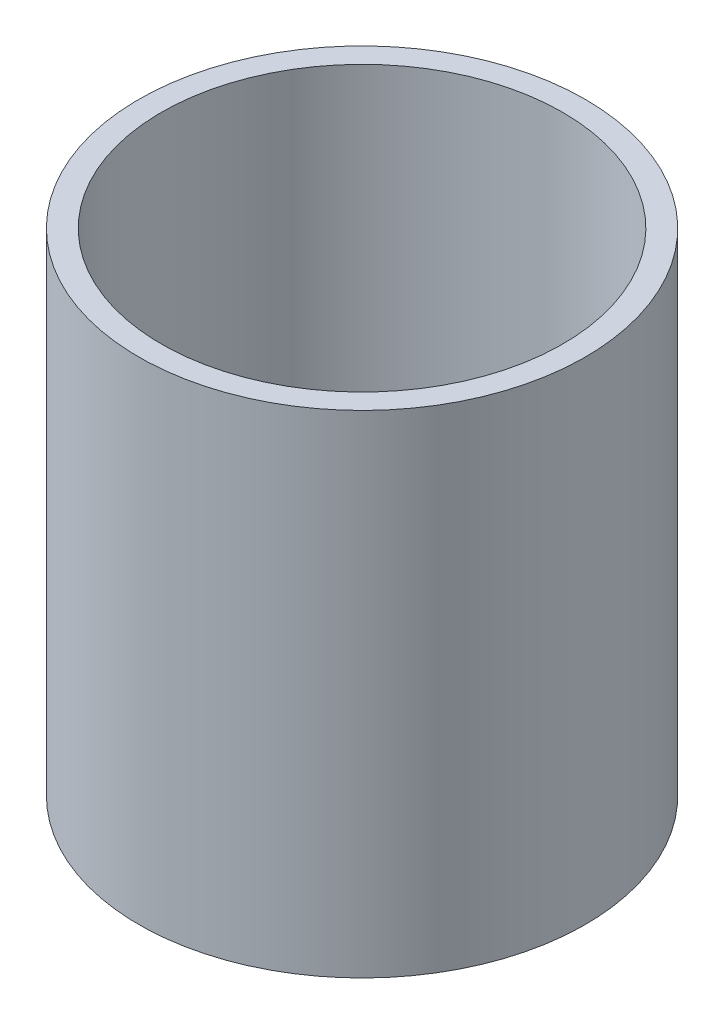
ISO-10303-21;
HEADER;
FILE_DESCRIPTION(('STEP AP214'),'2;1');
FILE_NAME('part.step','',(''),(''),'','','');
FILE_SCHEMA(('AUTOMOTIVE_DESIGN { 1 0 10303 214 1 1 1 1 }'));
ENDSEC;
DATA;
#1=APPLICATION_CONTEXT('core data for automotive mechanical design processes');
#2=APPLICATION_PROTOCOL_DEFINITION('international standard','automotive_design',2000,#1);
#3=PRODUCT_CONTEXT('',#1,'mechanical');
#4=PRODUCT('Part','Part','',(#3));
#5=PRODUCT_RELATED_PRODUCT_CATEGORY('part','',(#4));
#6=PRODUCT_DEFINITION_FORMATION('','',#4);
#7=PRODUCT_DEFINITION_CONTEXT('part definition',#1,'design');
#8=PRODUCT_DEFINITION('design','',#6,#7);
#9=PRODUCT_DEFINITION_SHAPE('','',#8);
#10=(LENGTH_UNIT() NAMED_UNIT(*) SI_UNIT(.MILLI.,.METRE.));
#11=(NAMED_UNIT(*) PLANE_ANGLE_UNIT() SI_UNIT($,.RADIAN.));
#12=(NAMED_UNIT(*) SI_UNIT($,.STERADIAN.) SOLID_ANGLE_UNIT());
#13=UNCERTAINTY_MEASURE_WITH_UNIT(LENGTH_MEASURE(1.E-05),#10,'distance_accuracy_value','');
#14=(GEOMETRIC_REPRESENTATION_CONTEXT(3) GLOBAL_UNCERTAINTY_ASSIGNED_CONTEXT((#13)) GLOBAL_UNIT_ASSIGNED_CONTEXT((#10,
#11,#12)) REPRESENTATION_CONTEXT('',''));
#15=CARTESIAN_POINT('',(0.,0.,0.));
#16=DIRECTION('',(0.,0.,1.));
#17=DIRECTION('',(1.,0.,0.));
#18=AXIS2_PLACEMENT_3D('',#15,#16,#17);
#19=CARTESIAN_POINT('',(0.,120.,0.));
#20=DIRECTION('',(0.,-1.,0.));
#21=DIRECTION('',(0.,0.,-1.));
#22=AXIS2_PLACEMENT_3D('',#19,#20,#21);
#23=CYLINDRICAL_SURFACE('',#22,49.);
#24=CARTESIAN_POINT('',(0.,0.,0.));
#25=DIRECTION('',(0.,-1.,0.));
#26=DIRECTION('',(0.,0.,-1.));
#27=AXIS2_PLACEMENT_3D('',#24,#25,#26);
#28=CIRCLE('',#27,49.);
#29=CARTESIAN_POINT('',(0.,0.,-49.));
#30=VERTEX_POINT('',#29);
#31=EDGE_CURVE('E26',#30,#30,#28,.T.);
#32=ORIENTED_EDGE('',*,*,#31,.T.);
#33=EDGE_LOOP('',(#32));
#34=FACE_BOUND('',#33,.T.);
#35=CARTESIAN_POINT('',(0.,120.,0.));
#36=DIRECTION('',(0.,-1.,0.));
#37=DIRECTION('',(0.,0.,-1.));
#38=AXIS2_PLACEMENT_3D('',#35,#36,#37);
#39=CIRCLE('',#38,49.);
#40=CARTESIAN_POINT('',(0.,120.,-49.));
#41=VERTEX_POINT('',#40);
#42=EDGE_CURVE('E17',#41,#41,#39,.T.);
#43=ORIENTED_EDGE('',*,*,#42,.F.);
#44=EDGE_LOOP('',(#43));
#45=FACE_BOUND('',#44,.T.);
#46=ADVANCED_FACE('F14',(#34,#45),#23,.F.);
#47=CARTESIAN_POINT('',(0.,120.,0.));
#48=DIRECTION('',(0.,1.,0.));
#49=DIRECTION('',(0.,0.,1.));
#50=AXIS2_PLACEMENT_3D('',#47,#48,#49);
#51=PLANE('',#50);
#52=ORIENTED_EDGE('',*,*,#42,.T.);
#53=EDGE_LOOP('',(#52));
#54=FACE_BOUND('',#53,.T.);
#55=CARTESIAN_POINT('',(0.,120.,0.));
#56=DIRECTION('',(0.,-1.,0.));
#57=DIRECTION('',(0.,0.,-1.));
#58=AXIS2_PLACEMENT_3D('',#55,#56,#57);
#59=CIRCLE('',#58,54.5);
#60=CARTESIAN_POINT('',(0.,120.,-54.5));
#61=VERTEX_POINT('',#60);
#62=EDGE_CURVE('E21',#61,#61,#59,.T.);
#63=ORIENTED_EDGE('',*,*,#62,.F.);
#64=EDGE_LOOP('',(#63));
#65=FACE_BOUND('',#64,.T.);
#66=ADVANCED_FACE('F34',(#54,#65),#51,.T.);
#67=CARTESIAN_POINT('',(0.,0.,0.));
#68=DIRECTION('',(0.,1.,0.));
#69=DIRECTION('',(0.,0.,1.));
#70=AXIS2_PLACEMENT_3D('',#67,#68,#69);
#71=PLANE('',#70);
#72=ORIENTED_EDGE('',*,*,#31,.F.);
#73=EDGE_LOOP('',(#72));
#74=FACE_BOUND('',#73,.T.);
#75=CARTESIAN_POINT('',(0.,0.,0.));
#76=DIRECTION('',(0.,-1.,0.));
#77=DIRECTION('',(0.,0.,-1.));
#78=AXIS2_PLACEMENT_3D('',#75,#76,#77);
#79=CIRCLE('',#78,54.5);
#80=CARTESIAN_POINT('',(0.,0.,-54.5));
#81=VERTEX_POINT('',#80);
#82=EDGE_CURVE('E10',#81,#81,#79,.F.);
#83=ORIENTED_EDGE('',*,*,#82,.F.);
#84=EDGE_LOOP('',(#83));
#85=FACE_BOUND('',#84,.T.);
#86=ADVANCED_FACE('F43',(#74,#85),#71,.F.);
#87=CARTESIAN_POINT('',(0.,120.,0.));
#88=DIRECTION('',(0.,-1.,0.));
#89=DIRECTION('',(0.,0.,-1.));
#90=AXIS2_PLACEMENT_3D('',#87,#88,#89);
#91=CYLINDRICAL_SURFACE('',#90,54.5);
#92=ORIENTED_EDGE('',*,*,#82,.T.);
#93=EDGE_LOOP('',(#92));
#94=FACE_BOUND('',#93,.T.);
#95=ORIENTED_EDGE('',*,*,#62,.T.);
#96=EDGE_LOOP('',(#95));
#97=FACE_BOUND('',#96,.T.);
#98=ADVANCED_FACE('F44',(#94,#97),#91,.T.);
#99=CLOSED_SHELL('',(#46,#66,#86,#98));
#100=MANIFOLD_SOLID_BREP('B1',#99);
#101=ADVANCED_BREP_SHAPE_REPRESENTATION('',(#18,#100),#14);
#102=SHAPE_DEFINITION_REPRESENTATION(#9,#101);
ENDSEC;
END-ISO-10303-21;
